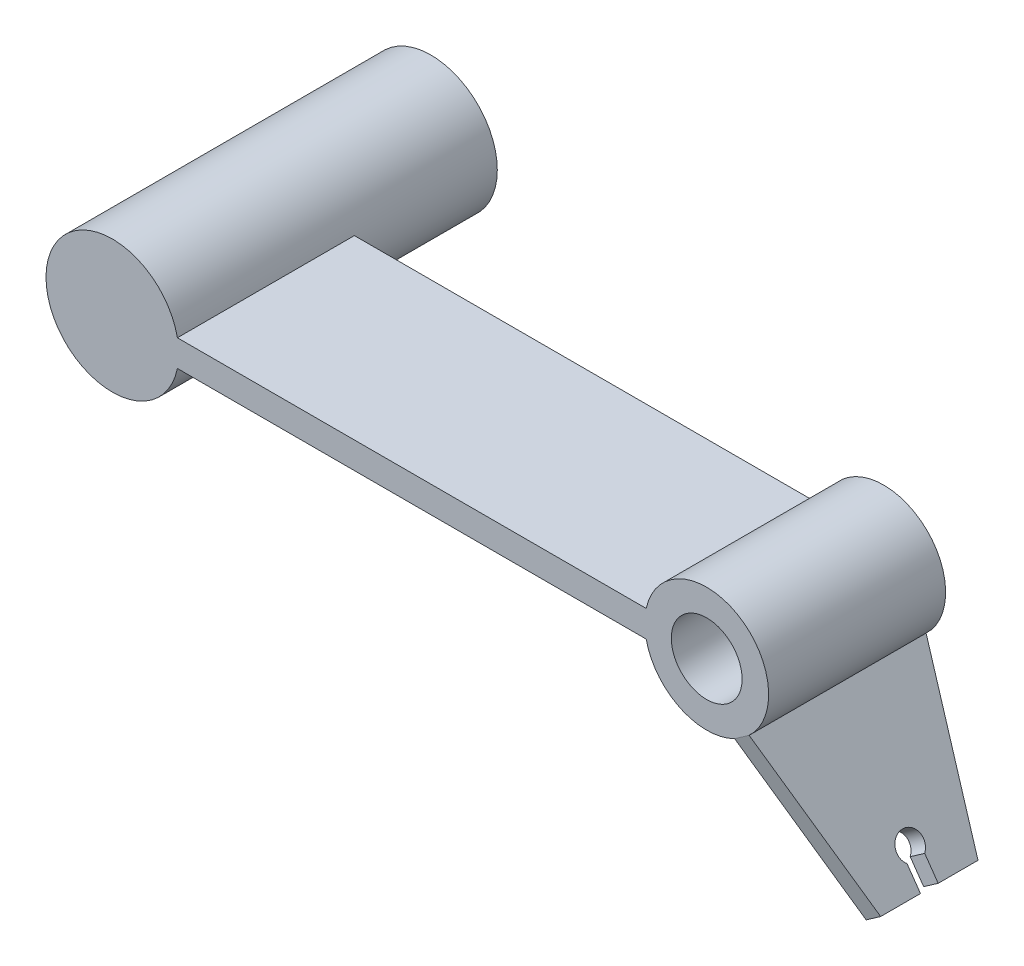
ISO-10303-21;
HEADER;
FILE_DESCRIPTION(('STEP AP214'),'2;1');
FILE_NAME('part.step','',(''),(''),'','','');
FILE_SCHEMA(('AUTOMOTIVE_DESIGN { 1 0 10303 214 1 1 1 1 }'));
ENDSEC;
DATA;
#1=APPLICATION_CONTEXT('core data for automotive mechanical design processes');
#2=APPLICATION_PROTOCOL_DEFINITION('international standard','automotive_design',2000,#1);
#3=PRODUCT_CONTEXT('',#1,'mechanical');
#4=PRODUCT('Part','Part','',(#3));
#5=PRODUCT_RELATED_PRODUCT_CATEGORY('part','',(#4));
#6=PRODUCT_DEFINITION_FORMATION('','',#4);
#7=PRODUCT_DEFINITION_CONTEXT('part definition',#1,'design');
#8=PRODUCT_DEFINITION('design','',#6,#7);
#9=PRODUCT_DEFINITION_SHAPE('','',#8);
#10=(LENGTH_UNIT() NAMED_UNIT(*) SI_UNIT(.MILLI.,.METRE.));
#11=(NAMED_UNIT(*) PLANE_ANGLE_UNIT() SI_UNIT($,.RADIAN.));
#12=(NAMED_UNIT(*) SI_UNIT($,.STERADIAN.) SOLID_ANGLE_UNIT());
#13=UNCERTAINTY_MEASURE_WITH_UNIT(LENGTH_MEASURE(1.E-05),#10,'distance_accuracy_value','');
#14=(GEOMETRIC_REPRESENTATION_CONTEXT(3) GLOBAL_UNCERTAINTY_ASSIGNED_CONTEXT((#13)) GLOBAL_UNIT_ASSIGNED_CONTEXT((#10,
#11,#12)) REPRESENTATION_CONTEXT('',''));
#15=CARTESIAN_POINT('',(0.,0.,0.));
#16=DIRECTION('',(0.,0.,1.));
#17=DIRECTION('',(1.,0.,0.));
#18=AXIS2_PLACEMENT_3D('',#15,#16,#17);
#19=CARTESIAN_POINT('',(0.,0.,20.));
#20=DIRECTION('',(0.,0.,-1.));
#21=DIRECTION('',(-1.,0.,0.));
#22=AXIS2_PLACEMENT_3D('',#19,#20,#21);
#23=CYLINDRICAL_SURFACE('',#22,7.);
#24=CARTESIAN_POINT('',(0.,0.,11.));
#25=DIRECTION('',(0.,0.,-1.));
#26=DIRECTION('',(-1.,0.,0.));
#27=AXIS2_PLACEMENT_3D('',#24,#25,#26);
#28=CIRCLE('',#27,7.);
#29=CARTESIAN_POINT('',(3.15470207484822,-6.24882827568083,11.));
#30=VERTEX_POINT('',#29);
#31=CARTESIAN_POINT('',(-6.83739716558867,-1.5,11.));
#32=VERTEX_POINT('',#31);
#33=EDGE_CURVE('E179',#30,#32,#28,.T.);
#34=ORIENTED_EDGE('',*,*,#33,.F.);
#35=DIRECTION('',(0.,0.,1.));
#36=VECTOR('',#35,1.);
#37=CARTESIAN_POINT('',(3.15470207484822,-6.24882827568083,-19.9629049680059));
#38=LINE('',#37,#36);
#39=CARTESIAN_POINT('',(3.15470207484822,-6.24882827568083,20.));
#40=VERTEX_POINT('',#39);
#41=EDGE_CURVE('E239',#30,#40,#38,.T.);
#42=ORIENTED_EDGE('',*,*,#41,.T.);
#43=CARTESIAN_POINT('',(0.,0.,20.));
#44=DIRECTION('',(0.,0.,1.));
#45=DIRECTION('',(1.,0.,0.));
#46=AXIS2_PLACEMENT_3D('',#43,#44,#45);
#47=CIRCLE('',#46,7.);
#48=CARTESIAN_POINT('',(-6.83739716558867,-1.5,20.));
#49=VERTEX_POINT('',#48);
#50=EDGE_CURVE('E260',#49,#40,#47,.T.);
#51=ORIENTED_EDGE('',*,*,#50,.F.);
#52=DIRECTION('',(0.,0.,-1.));
#53=VECTOR('',#52,1.);
#54=CARTESIAN_POINT('',(-6.83739716558867,-1.5,20.));
#55=LINE('',#54,#53);
#56=EDGE_CURVE('E279',#49,#32,#55,.T.);
#57=ORIENTED_EDGE('',*,*,#56,.T.);
#58=EDGE_LOOP('',(#34,#42,#51,#57));
#59=FACE_BOUND('',#58,.T.);
#60=ADVANCED_FACE('F38',(#59),#23,.T.);
#61=CARTESIAN_POINT('',(-67.1626028344113,-1.5,20.));
#62=DIRECTION('',(0.,1.,0.));
#63=DIRECTION('',(-1.,0.,0.));
#64=AXIS2_PLACEMENT_3D('',#61,#62,#63);
#65=PLANE('',#64);
#66=DIRECTION('',(-1.,0.,0.));
#67=VECTOR('',#66,1.);
#68=CARTESIAN_POINT('',(-6.83739716558867,-1.5,11.));
#69=LINE('',#68,#67);
#70=CARTESIAN_POINT('',(-25.2484276325332,-1.5,11.));
#71=VERTEX_POINT('',#70);
#72=EDGE_CURVE('E170',#32,#71,#69,.T.);
#73=ORIENTED_EDGE('',*,*,#72,.F.);
#74=ORIENTED_EDGE('',*,*,#56,.F.);
#75=DIRECTION('',(1.,0.,0.));
#76=VECTOR('',#75,1.);
#77=CARTESIAN_POINT('',(-67.1626028344113,-1.5,20.));
#78=LINE('',#77,#76);
#79=CARTESIAN_POINT('',(-59.8141336060618,-1.5,20.));
#80=VERTEX_POINT('',#79);
#81=EDGE_CURVE('E267',#80,#49,#78,.T.);
#82=ORIENTED_EDGE('',*,*,#81,.F.);
#83=DIRECTION('',(0.,0.,1.));
#84=VECTOR('',#83,1.);
#85=CARTESIAN_POINT('',(-59.8141336060618,-1.5,-16.));
#86=LINE('',#85,#84);
#87=CARTESIAN_POINT('',(-59.8141336060618,-1.5,0.));
#88=VERTEX_POINT('',#87);
#89=EDGE_CURVE('E11',#80,#88,#86,.F.);
#90=ORIENTED_EDGE('',*,*,#89,.T.);
#91=DIRECTION('',(1.,0.,0.));
#92=VECTOR('',#91,1.);
#93=CARTESIAN_POINT('',(-67.1626028344113,-1.5,0.));
#94=LINE('',#93,#92);
#95=CARTESIAN_POINT('',(-6.83739716558867,-1.5,0.));
#96=VERTEX_POINT('',#95);
#97=EDGE_CURVE('E276',#88,#96,#94,.T.);
#98=ORIENTED_EDGE('',*,*,#97,.T.);
#99=CARTESIAN_POINT('',(-6.83739716558867,-1.5,9.00000000000001));
#100=VERTEX_POINT('',#99);
#101=EDGE_CURVE('E269',#100,#96,#55,.T.);
#102=ORIENTED_EDGE('',*,*,#101,.F.);
#103=DIRECTION('',(-1.,0.,0.));
#104=VECTOR('',#103,1.);
#105=CARTESIAN_POINT('',(-6.83739716558867,-1.5,9.00000000000001));
#106=LINE('',#105,#104);
#107=CARTESIAN_POINT('',(-25.2484276325332,-1.5,9.00000000000001));
#108=VERTEX_POINT('',#107);
#109=EDGE_CURVE('E58',#100,#108,#106,.T.);
#110=ORIENTED_EDGE('',*,*,#109,.T.);
#111=DIRECTION('',(0.,0.,-1.));
#112=VECTOR('',#111,1.);
#113=CARTESIAN_POINT('',(-25.2484276325332,-1.5,11.));
#114=LINE('',#113,#112);
#115=EDGE_CURVE('E53',#71,#108,#114,.T.);
#116=ORIENTED_EDGE('',*,*,#115,.F.);
#117=EDGE_LOOP('',(#73,#74,#82,#90,#98,#102,#110,#116));
#118=FACE_BOUND('',#117,.T.);
#119=ADVANCED_FACE('F302',(#118),#65,.F.);
#120=CARTESIAN_POINT('',(13.5202588644871,-21.0523775435759,-19.9629049680059));
#121=DIRECTION('',(-0.819152044288993,-0.573576436351045,0.));
#122=DIRECTION('',(0.573576436351045,-0.819152044288993,0.));
#123=AXIS2_PLACEMENT_3D('',#120,#121,#122);
#124=PLANE('',#123);
#125=ORIENTED_EDGE('',*,*,#41,.F.);
#126=DIRECTION('',(-0.573576436351044,0.819152044288993,0.));
#127=VECTOR('',#126,1.);
#128=CARTESIAN_POINT('',(8.33748046966767,-13.6506029096284,11.));
#129=LINE('',#128,#127);
#130=CARTESIAN_POINT('',(8.33748046966767,-13.6506029096284,11.));
#131=VERTEX_POINT('',#130);
#132=EDGE_CURVE('E159',#131,#30,#129,.T.);
#133=ORIENTED_EDGE('',*,*,#132,.F.);
#134=DIRECTION('',(0.,0.,-1.));
#135=VECTOR('',#134,1.);
#136=CARTESIAN_POINT('',(8.33748046966767,-13.6506029096284,11.));
#137=LINE('',#136,#135);
#138=CARTESIAN_POINT('',(8.33748046966767,-13.6506029096284,9.00000000000001));
#139=VERTEX_POINT('',#138);
#140=EDGE_CURVE('E150',#131,#139,#137,.T.);
#141=ORIENTED_EDGE('',*,*,#140,.T.);
#142=DIRECTION('',(-0.573576436351044,0.819152044288993,0.));
#143=VECTOR('',#142,1.);
#144=CARTESIAN_POINT('',(8.33748046966767,-13.6506029096284,9.00000000000001));
#145=LINE('',#144,#143);
#146=CARTESIAN_POINT('',(3.15470207484822,-6.24882827568083,9.00000000000001));
#147=VERTEX_POINT('',#146);
#148=EDGE_CURVE('E156',#139,#147,#145,.T.);
#149=ORIENTED_EDGE('',*,*,#148,.T.);
#150=CARTESIAN_POINT('',(3.15470207484822,-6.24882827568083,0.));
#151=VERTEX_POINT('',#150);
#152=EDGE_CURVE('E237',#151,#147,#38,.T.);
#153=ORIENTED_EDGE('',*,*,#152,.F.);
#154=DIRECTION('',(0.556580706443766,-0.794879626498786,0.241628426704534));
#155=VECTOR('',#154,1.);
#156=CARTESIAN_POINT('',(13.5202588644871,-21.0523775435759,4.49999999999999));
#157=LINE('',#156,#155);
#158=CARTESIAN_POINT('',(13.5202588644871,-21.0523775435759,4.49999999999998));
#159=VERTEX_POINT('',#158);
#160=EDGE_CURVE('E184',#151,#159,#157,.T.);
#161=ORIENTED_EDGE('',*,*,#160,.T.);
#162=DIRECTION('',(0.,0.,1.));
#163=VECTOR('',#162,1.);
#164=CARTESIAN_POINT('',(13.5202588644871,-21.0523775435759,-19.9629049680059));
#165=LINE('',#164,#163);
#166=CARTESIAN_POINT('',(13.5202588644871,-21.0523775435759,9.));
#167=VERTEX_POINT('',#166);
#168=EDGE_CURVE('E234',#159,#167,#165,.T.);
#169=ORIENTED_EDGE('',*,*,#168,.T.);
#170=DIRECTION('',(0.573576436351045,-0.819152044288993,0.));
#171=VECTOR('',#170,1.);
#172=CARTESIAN_POINT('',(11.9981230656547,-18.8785423364825,9.));
#173=LINE('',#172,#171);
#174=CARTESIAN_POINT('',(11.9981230656547,-18.8785423364825,9.));
#175=VERTEX_POINT('',#174);
#176=EDGE_CURVE('E202',#175,#167,#173,.T.);
#177=ORIENTED_EDGE('',*,*,#176,.F.);
#178=CARTESIAN_POINT('',(11.3568451146682,-17.9627025090134,10.));
#179=DIRECTION('',(-0.819152044288993,-0.573576436351045,0.));
#180=DIRECTION('',(0.573576436351045,-0.819152044288993,0.));
#181=AXIS2_PLACEMENT_3D('',#178,#179,#180);
#182=CIRCLE('',#181,1.5);
#183=CARTESIAN_POINT('',(11.9981230656547,-18.8785423364825,11.));
#184=VERTEX_POINT('',#183);
#185=EDGE_CURVE('E208',#175,#184,#182,.F.);
#186=ORIENTED_EDGE('',*,*,#185,.T.);
#187=DIRECTION('',(0.573576436351045,-0.819152044288993,0.));
#188=VECTOR('',#187,1.);
#189=CARTESIAN_POINT('',(11.9981230656547,-18.8785423364825,11.));
#190=LINE('',#189,#188);
#191=CARTESIAN_POINT('',(13.5202588644871,-21.0523775435759,11.));
#192=VERTEX_POINT('',#191);
#193=EDGE_CURVE('E219',#184,#192,#190,.T.);
#194=ORIENTED_EDGE('',*,*,#193,.T.);
#195=CARTESIAN_POINT('',(13.5202588644871,-21.0523775435759,15.5));
#196=VERTEX_POINT('',#195);
#197=EDGE_CURVE('E236',#192,#196,#165,.T.);
#198=ORIENTED_EDGE('',*,*,#197,.T.);
#199=DIRECTION('',(-0.556580706443766,0.794879626498786,0.241628426704534));
#200=VECTOR('',#199,1.);
#201=CARTESIAN_POINT('',(3.15470207484821,-6.24882827568081,20.));
#202=LINE('',#201,#200);
#203=EDGE_CURVE('E195',#196,#40,#202,.T.);
#204=ORIENTED_EDGE('',*,*,#203,.T.);
#205=EDGE_LOOP('',(#125,#133,#141,#149,#153,#161,#169,#177,#186,#194,#198,#204));
#206=FACE_BOUND('',#205,.T.);
#207=ADVANCED_FACE('F153',(#206),#124,.T.);
#208=CARTESIAN_POINT('',(15.1585629530651,-19.9052246708738,-19.9629049680059));
#209=DIRECTION('',(0.573576436351044,-0.819152044288993,0.));
#210=DIRECTION('',(0.819152044288993,0.573576436351044,0.));
#211=AXIS2_PLACEMENT_3D('',#208,#209,#210);
#212=PLANE('',#211);
#213=DIRECTION('',(0.819152044288993,0.573576436351044,0.));
#214=VECTOR('',#213,1.);
#215=CARTESIAN_POINT('',(-45.6524703399068,-62.4855685889341,4.5));
#216=LINE('',#215,#214);
#217=CARTESIAN_POINT('',(15.1585629530651,-19.9052246708738,4.5));
#218=VERTEX_POINT('',#217);
#219=EDGE_CURVE('E189',#159,#218,#216,.T.);
#220=ORIENTED_EDGE('',*,*,#219,.T.);
#221=DIRECTION('',(0.,0.,1.));
#222=VECTOR('',#221,1.);
#223=CARTESIAN_POINT('',(15.1585629530651,-19.9052246708738,-19.9629049680059));
#224=LINE('',#223,#222);
#225=CARTESIAN_POINT('',(15.1585629530651,-19.9052246708738,9.));
#226=VERTEX_POINT('',#225);
#227=EDGE_CURVE('E230',#218,#226,#224,.T.);
#228=ORIENTED_EDGE('',*,*,#227,.T.);
#229=DIRECTION('',(0.819152044288993,0.573576436351044,0.));
#230=VECTOR('',#229,1.);
#231=CARTESIAN_POINT('',(8.55158741351989,-24.5314787484305,9.));
#232=LINE('',#231,#230);
#233=EDGE_CURVE('E223',#167,#226,#232,.T.);
#234=ORIENTED_EDGE('',*,*,#233,.F.);
#235=ORIENTED_EDGE('',*,*,#168,.F.);
#236=EDGE_LOOP('',(#220,#228,#234,#235));
#237=FACE_BOUND('',#236,.T.);
#238=ADVANCED_FACE('F328',(#237),#212,.T.);
#239=CARTESIAN_POINT('',(4.79300616342621,-5.10167540297874,20.));
#240=VERTEX_POINT('',#239);
#241=CARTESIAN_POINT('',(-6.83739716558867,1.5,20.));
#242=VERTEX_POINT('',#241);
#243=EDGE_CURVE('E264',#240,#242,#47,.T.);
#244=ORIENTED_EDGE('',*,*,#243,.F.);
#245=DIRECTION('',(0.,0.,1.));
#246=VECTOR('',#245,1.);
#247=CARTESIAN_POINT('',(4.79300616342621,-5.10167540297874,-19.9629049680059));
#248=LINE('',#247,#246);
#249=CARTESIAN_POINT('',(4.79300616342622,-5.10167540297874,0.));
#250=VERTEX_POINT('',#249);
#251=EDGE_CURVE('E212',#250,#240,#248,.T.);
#252=ORIENTED_EDGE('',*,*,#251,.F.);
#253=CARTESIAN_POINT('',(0.,0.,0.));
#254=DIRECTION('',(0.,0.,1.));
#255=DIRECTION('',(1.,0.,0.));
#256=AXIS2_PLACEMENT_3D('',#253,#254,#255);
#257=CIRCLE('',#256,7.);
#258=CARTESIAN_POINT('',(-6.83739716558867,1.5,0.));
#259=VERTEX_POINT('',#258);
#260=EDGE_CURVE('E257',#250,#259,#257,.T.);
#261=ORIENTED_EDGE('',*,*,#260,.T.);
#262=DIRECTION('',(0.,0.,-1.));
#263=VECTOR('',#262,1.);
#264=CARTESIAN_POINT('',(-6.83739716558867,1.5,20.));
#265=LINE('',#264,#263);
#266=EDGE_CURVE('E46',#242,#259,#265,.T.);
#267=ORIENTED_EDGE('',*,*,#266,.F.);
#268=EDGE_LOOP('',(#244,#252,#261,#267));
#269=FACE_BOUND('',#268,.T.);
#270=ADVANCED_FACE('F289',(#269),#23,.T.);
#271=CARTESIAN_POINT('',(0.,0.,20.));
#272=DIRECTION('',(0.,0.,1.));
#273=DIRECTION('',(1.,0.,0.));
#274=AXIS2_PLACEMENT_3D('',#271,#272,#273);
#275=PLANE('',#274);
#276=DIRECTION('',(0.819152044288993,0.573576436351044,0.));
#277=VECTOR('',#276,1.);
#278=CARTESIAN_POINT('',(-56.0180271295457,-47.6820193210391,20.));
#279=LINE('',#278,#277);
#280=EDGE_CURVE('E192',#40,#240,#279,.T.);
#281=ORIENTED_EDGE('',*,*,#280,.T.);
#282=ORIENTED_EDGE('',*,*,#243,.T.);
#283=DIRECTION('',(-1.,0.,0.));
#284=VECTOR('',#283,1.);
#285=CARTESIAN_POINT('',(-67.1626028344113,1.5,20.));
#286=LINE('',#285,#284);
#287=CARTESIAN_POINT('',(-59.8141336060618,1.5,20.));
#288=VERTEX_POINT('',#287);
#289=EDGE_CURVE('E263',#242,#288,#286,.T.);
#290=ORIENTED_EDGE('',*,*,#289,.T.);
#291=CARTESIAN_POINT('',(-67.1626028344113,0.,20.));
#292=DIRECTION('',(0.,0.,1.));
#293=DIRECTION('',(1.,0.,0.));
#294=AXIS2_PLACEMENT_3D('',#291,#292,#293);
#295=CIRCLE('',#294,7.5);
#296=EDGE_CURVE('E232',#288,#80,#295,.T.);
#297=ORIENTED_EDGE('',*,*,#296,.T.);
#298=ORIENTED_EDGE('',*,*,#81,.T.);
#299=ORIENTED_EDGE('',*,*,#50,.T.);
#300=EDGE_LOOP('',(#281,#282,#290,#297,#298,#299));
#301=FACE_BOUND('',#300,.T.);
#302=CARTESIAN_POINT('',(0.,0.,20.));
#303=DIRECTION('',(0.,0.,1.));
#304=DIRECTION('',(1.,0.,0.));
#305=AXIS2_PLACEMENT_3D('',#302,#303,#304);
#306=CIRCLE('',#305,4.);
#307=CARTESIAN_POINT('',(4.,0.,20.));
#308=VERTEX_POINT('',#307);
#309=EDGE_CURVE('E253',#308,#308,#306,.T.);
#310=ORIENTED_EDGE('',*,*,#309,.F.);
#311=EDGE_LOOP('',(#310));
#312=FACE_BOUND('',#311,.T.);
#313=ADVANCED_FACE('F306',(#301,#312),#275,.T.);
#314=CARTESIAN_POINT('',(0.,0.,0.));
#315=DIRECTION('',(0.,0.,1.));
#316=DIRECTION('',(1.,0.,0.));
#317=AXIS2_PLACEMENT_3D('',#314,#315,#316);
#318=PLANE('',#317);
#319=ORIENTED_EDGE('',*,*,#260,.F.);
#320=DIRECTION('',(0.819152044288993,0.573576436351044,0.));
#321=VECTOR('',#320,1.);
#322=CARTESIAN_POINT('',(-56.0180271295457,-47.6820193210391,0.));
#323=LINE('',#322,#321);
#324=EDGE_CURVE('E182',#151,#250,#323,.T.);
#325=ORIENTED_EDGE('',*,*,#324,.F.);
#326=EDGE_CURVE('E270',#96,#151,#257,.T.);
#327=ORIENTED_EDGE('',*,*,#326,.F.);
#328=ORIENTED_EDGE('',*,*,#97,.F.);
#329=CARTESIAN_POINT('',(-67.1626028344113,0.,0.));
#330=DIRECTION('',(0.,0.,1.));
#331=DIRECTION('',(1.,0.,0.));
#332=AXIS2_PLACEMENT_3D('',#329,#330,#331);
#333=CIRCLE('',#332,7.5);
#334=CARTESIAN_POINT('',(-59.8141336060618,1.5,0.));
#335=VERTEX_POINT('',#334);
#336=EDGE_CURVE('E245',#88,#335,#333,.T.);
#337=ORIENTED_EDGE('',*,*,#336,.T.);
#338=DIRECTION('',(-1.,0.,0.));
#339=VECTOR('',#338,1.);
#340=CARTESIAN_POINT('',(-67.1626028344113,1.5,0.));
#341=LINE('',#340,#339);
#342=EDGE_CURVE('E273',#259,#335,#341,.T.);
#343=ORIENTED_EDGE('',*,*,#342,.F.);
#344=EDGE_LOOP('',(#319,#325,#327,#328,#337,#343));
#345=FACE_BOUND('',#344,.T.);
#346=CARTESIAN_POINT('',(0.,0.,0.));
#347=DIRECTION('',(0.,0.,1.));
#348=DIRECTION('',(1.,0.,0.));
#349=AXIS2_PLACEMENT_3D('',#346,#347,#348);
#350=CIRCLE('',#349,4.);
#351=CARTESIAN_POINT('',(4.,0.,0.));
#352=VERTEX_POINT('',#351);
#353=EDGE_CURVE('E252',#352,#352,#350,.T.);
#354=ORIENTED_EDGE('',*,*,#353,.T.);
#355=EDGE_LOOP('',(#354));
#356=FACE_BOUND('',#355,.T.);
#357=ADVANCED_FACE('F294',(#345,#356),#318,.F.);
#358=ORIENTED_EDGE('',*,*,#152,.T.);
#359=CARTESIAN_POINT('',(0.,0.,9.00000000000001));
#360=DIRECTION('',(0.,0.,-1.));
#361=DIRECTION('',(-1.,0.,0.));
#362=AXIS2_PLACEMENT_3D('',#359,#360,#361);
#363=CIRCLE('',#362,7.);
#364=EDGE_CURVE('E169',#147,#100,#363,.T.);
#365=ORIENTED_EDGE('',*,*,#364,.T.);
#366=ORIENTED_EDGE('',*,*,#101,.T.);
#367=ORIENTED_EDGE('',*,*,#326,.T.);
#368=EDGE_LOOP('',(#358,#365,#366,#367));
#369=FACE_BOUND('',#368,.T.);
#370=ADVANCED_FACE('F40',(#369),#23,.T.);
#371=CARTESIAN_POINT('',(-67.1626028344113,1.5,20.));
#372=DIRECTION('',(0.,-1.,0.));
#373=DIRECTION('',(1.,0.,0.));
#374=AXIS2_PLACEMENT_3D('',#371,#372,#373);
#375=PLANE('',#374);
#376=ORIENTED_EDGE('',*,*,#342,.T.);
#377=DIRECTION('',(0.,0.,1.));
#378=VECTOR('',#377,1.);
#379=CARTESIAN_POINT('',(-59.8141336060618,1.5,-16.));
#380=LINE('',#379,#378);
#381=EDGE_CURVE('E249',#335,#288,#380,.T.);
#382=ORIENTED_EDGE('',*,*,#381,.T.);
#383=ORIENTED_EDGE('',*,*,#289,.F.);
#384=ORIENTED_EDGE('',*,*,#266,.T.);
#385=EDGE_LOOP('',(#376,#382,#383,#384));
#386=FACE_BOUND('',#385,.T.);
#387=ADVANCED_FACE('F285',(#386),#375,.F.);
#388=CARTESIAN_POINT('',(0.,0.,20.));
#389=DIRECTION('',(0.,0.,-1.));
#390=DIRECTION('',(-1.,0.,0.));
#391=AXIS2_PLACEMENT_3D('',#388,#389,#390);
#392=CYLINDRICAL_SURFACE('',#391,4.);
#393=ORIENTED_EDGE('',*,*,#309,.T.);
#394=EDGE_LOOP('',(#393));
#395=FACE_BOUND('',#394,.T.);
#396=ORIENTED_EDGE('',*,*,#353,.F.);
#397=EDGE_LOOP('',(#396));
#398=FACE_BOUND('',#397,.T.);
#399=ADVANCED_FACE('F362',(#395,#398),#392,.F.);
#400=CARTESIAN_POINT('',(-67.1626028344113,0.,-16.));
#401=DIRECTION('',(0.,0.,1.));
#402=DIRECTION('',(1.,0.,0.));
#403=AXIS2_PLACEMENT_3D('',#400,#401,#402);
#404=CYLINDRICAL_SURFACE('',#403,7.5);
#405=CARTESIAN_POINT('',(-67.1626028344113,0.,-16.));
#406=DIRECTION('',(0.,0.,1.));
#407=DIRECTION('',(1.,0.,0.));
#408=AXIS2_PLACEMENT_3D('',#405,#406,#407);
#409=CIRCLE('',#408,7.5);
#410=CARTESIAN_POINT('',(-59.6626028344113,0.,-16.));
#411=VERTEX_POINT('',#410);
#412=EDGE_CURVE('E242',#411,#411,#409,.T.);
#413=ORIENTED_EDGE('',*,*,#412,.T.);
#414=EDGE_LOOP('',(#413));
#415=FACE_BOUND('',#414,.T.);
#416=ORIENTED_EDGE('',*,*,#381,.F.);
#417=ORIENTED_EDGE('',*,*,#336,.F.);
#418=ORIENTED_EDGE('',*,*,#89,.F.);
#419=ORIENTED_EDGE('',*,*,#296,.F.);
#420=EDGE_LOOP('',(#416,#417,#418,#419));
#421=FACE_BOUND('',#420,.T.);
#422=ADVANCED_FACE('F300',(#415,#421),#404,.T.);
#423=CARTESIAN_POINT('',(-67.1626028344113,0.,-16.));
#424=DIRECTION('',(0.,0.,1.));
#425=DIRECTION('',(1.,0.,0.));
#426=AXIS2_PLACEMENT_3D('',#423,#424,#425);
#427=PLANE('',#426);
#428=ORIENTED_EDGE('',*,*,#412,.F.);
#429=EDGE_LOOP('',(#428));
#430=FACE_BOUND('',#429,.T.);
#431=ADVANCED_FACE('F468',(#430),#427,.F.);
#432=CARTESIAN_POINT('',(15.1585629530651,-19.9052246708738,-19.9629049680059));
#433=DIRECTION('',(0.819152044288993,0.573576436351044,0.));
#434=DIRECTION('',(-0.573576436351044,0.819152044288993,0.));
#435=AXIS2_PLACEMENT_3D('',#432,#433,#434);
#436=PLANE('',#435);
#437=DIRECTION('',(0.556580706443766,-0.794879626498786,0.241628426704534));
#438=VECTOR('',#437,1.);
#439=CARTESIAN_POINT('',(15.1585629530651,-19.9052246708738,4.5));
#440=LINE('',#439,#438);
#441=EDGE_CURVE('E187',#250,#218,#440,.T.);
#442=ORIENTED_EDGE('',*,*,#441,.F.);
#443=ORIENTED_EDGE('',*,*,#251,.T.);
#444=DIRECTION('',(-0.556580706443766,0.794879626498786,0.241628426704534));
#445=VECTOR('',#444,1.);
#446=CARTESIAN_POINT('',(4.79300616342622,-5.10167540297874,20.));
#447=LINE('',#446,#445);
#448=CARTESIAN_POINT('',(15.1585629530651,-19.9052246708738,15.5));
#449=VERTEX_POINT('',#448);
#450=EDGE_CURVE('E198',#449,#240,#447,.T.);
#451=ORIENTED_EDGE('',*,*,#450,.F.);
#452=CARTESIAN_POINT('',(15.1585629530651,-19.9052246708738,11.));
#453=VERTEX_POINT('',#452);
#454=EDGE_CURVE('E233',#453,#449,#224,.T.);
#455=ORIENTED_EDGE('',*,*,#454,.F.);
#456=DIRECTION('',(0.573576436351044,-0.819152044288993,0.));
#457=VECTOR('',#456,1.);
#458=CARTESIAN_POINT('',(13.6364271542327,-17.7313894637804,11.));
#459=LINE('',#458,#457);
#460=CARTESIAN_POINT('',(13.6364271542327,-17.7313894637804,11.));
#461=VERTEX_POINT('',#460);
#462=EDGE_CURVE('E206',#461,#453,#459,.T.);
#463=ORIENTED_EDGE('',*,*,#462,.F.);
#464=CARTESIAN_POINT('',(12.9951492032462,-16.8155496363113,10.));
#465=DIRECTION('',(0.819152044288993,0.573576436351044,0.));
#466=DIRECTION('',(-0.573576436351044,0.819152044288993,0.));
#467=AXIS2_PLACEMENT_3D('',#464,#465,#466);
#468=CIRCLE('',#467,1.5);
#469=CARTESIAN_POINT('',(13.6364271542327,-17.7313894637804,9.));
#470=VERTEX_POINT('',#469);
#471=EDGE_CURVE('E203',#470,#461,#468,.T.);
#472=ORIENTED_EDGE('',*,*,#471,.F.);
#473=DIRECTION('',(0.573576436351045,-0.819152044288993,0.));
#474=VECTOR('',#473,1.);
#475=CARTESIAN_POINT('',(13.6364271542327,-17.7313894637804,9.));
#476=LINE('',#475,#474);
#477=EDGE_CURVE('E209',#470,#226,#476,.T.);
#478=ORIENTED_EDGE('',*,*,#477,.T.);
#479=ORIENTED_EDGE('',*,*,#227,.F.);
#480=EDGE_LOOP('',(#442,#443,#451,#455,#463,#472,#478,#479));
#481=FACE_BOUND('',#480,.T.);
#482=ADVANCED_FACE('F321',(#481),#436,.T.);
#483=DIRECTION('',(0.819152044288993,0.573576436351044,0.));
#484=VECTOR('',#483,1.);
#485=CARTESIAN_POINT('',(-45.6524703399068,-62.4855685889341,15.5));
#486=LINE('',#485,#484);
#487=EDGE_CURVE('E200',#196,#449,#486,.T.);
#488=ORIENTED_EDGE('',*,*,#487,.F.);
#489=ORIENTED_EDGE('',*,*,#197,.F.);
#490=DIRECTION('',(0.819152044288993,0.573576436351044,0.));
#491=VECTOR('',#490,1.);
#492=CARTESIAN_POINT('',(8.55158741351989,-24.5314787484305,11.));
#493=LINE('',#492,#491);
#494=EDGE_CURVE('E222',#192,#453,#493,.T.);
#495=ORIENTED_EDGE('',*,*,#494,.T.);
#496=ORIENTED_EDGE('',*,*,#454,.T.);
#497=EDGE_LOOP('',(#488,#489,#495,#496));
#498=FACE_BOUND('',#497,.T.);
#499=ADVANCED_FACE('F316',(#498),#212,.T.);
#500=CARTESIAN_POINT('',(6.38817366370093,-21.441803713868,10.));
#501=DIRECTION('',(0.819152044288993,0.573576436351044,0.));
#502=DIRECTION('',(-0.573576436351044,0.819152044288993,0.));
#503=AXIS2_PLACEMENT_3D('',#500,#501,#502);
#504=CYLINDRICAL_SURFACE('',#503,1.5);
#505=DIRECTION('',(0.819152044288993,0.573576436351044,0.));
#506=VECTOR('',#505,1.);
#507=CARTESIAN_POINT('',(7.02945161468744,-22.3576435413371,9.));
#508=LINE('',#507,#506);
#509=EDGE_CURVE('E213',#175,#470,#508,.T.);
#510=ORIENTED_EDGE('',*,*,#509,.T.);
#511=ORIENTED_EDGE('',*,*,#471,.T.);
#512=DIRECTION('',(0.819152044288993,0.573576436351044,0.));
#513=VECTOR('',#512,1.);
#514=CARTESIAN_POINT('',(7.02945161468744,-22.3576435413371,11.));
#515=LINE('',#514,#513);
#516=EDGE_CURVE('E216',#184,#461,#515,.T.);
#517=ORIENTED_EDGE('',*,*,#516,.F.);
#518=ORIENTED_EDGE('',*,*,#185,.F.);
#519=EDGE_LOOP('',(#510,#511,#517,#518));
#520=FACE_BOUND('',#519,.T.);
#521=ADVANCED_FACE('F338',(#520),#504,.F.);
#522=CARTESIAN_POINT('',(7.02945161468744,-22.3576435413371,11.));
#523=DIRECTION('',(0.,0.,1.));
#524=DIRECTION('',(1.,0.,0.));
#525=AXIS2_PLACEMENT_3D('',#522,#523,#524);
#526=PLANE('',#525);
#527=ORIENTED_EDGE('',*,*,#516,.T.);
#528=ORIENTED_EDGE('',*,*,#462,.T.);
#529=ORIENTED_EDGE('',*,*,#494,.F.);
#530=ORIENTED_EDGE('',*,*,#193,.F.);
#531=EDGE_LOOP('',(#527,#528,#529,#530));
#532=FACE_BOUND('',#531,.T.);
#533=ADVANCED_FACE('F340',(#532),#526,.F.);
#534=CARTESIAN_POINT('',(7.02945161468744,-22.3576435413371,9.));
#535=DIRECTION('',(0.,0.,1.));
#536=DIRECTION('',(0.,-1.,0.));
#537=AXIS2_PLACEMENT_3D('',#534,#535,#536);
#538=PLANE('',#537);
#539=ORIENTED_EDGE('',*,*,#176,.T.);
#540=ORIENTED_EDGE('',*,*,#233,.T.);
#541=ORIENTED_EDGE('',*,*,#477,.F.);
#542=ORIENTED_EDGE('',*,*,#509,.F.);
#543=EDGE_LOOP('',(#539,#540,#541,#542));
#544=FACE_BOUND('',#543,.T.);
#545=ADVANCED_FACE('F332',(#544),#538,.T.);
#546=CARTESIAN_POINT('',(-56.0180271295457,-47.6820193210391,20.));
#547=DIRECTION('',(-0.138592371910296,0.197930419693352,-0.970368849153914));
#548=DIRECTION('',(0.,0.979824635770892,0.199859158250099));
#549=AXIS2_PLACEMENT_3D('',#546,#547,#548);
#550=PLANE('',#549);
#551=ORIENTED_EDGE('',*,*,#487,.T.);
#552=ORIENTED_EDGE('',*,*,#450,.T.);
#553=ORIENTED_EDGE('',*,*,#280,.F.);
#554=ORIENTED_EDGE('',*,*,#203,.F.);
#555=EDGE_LOOP('',(#551,#552,#553,#554));
#556=FACE_BOUND('',#555,.T.);
#557=ADVANCED_FACE('F310',(#556),#550,.F.);
#558=CARTESIAN_POINT('',(-45.6524703399068,-62.4855685889341,4.5));
#559=DIRECTION('',(-0.138592371910296,0.197930419693352,0.970368849153914));
#560=DIRECTION('',(0.,-0.979824635770892,0.199859158250099));
#561=AXIS2_PLACEMENT_3D('',#558,#559,#560);
#562=PLANE('',#561);
#563=ORIENTED_EDGE('',*,*,#324,.T.);
#564=ORIENTED_EDGE('',*,*,#441,.T.);
#565=ORIENTED_EDGE('',*,*,#219,.F.);
#566=ORIENTED_EDGE('',*,*,#160,.F.);
#567=EDGE_LOOP('',(#563,#564,#565,#566));
#568=FACE_BOUND('',#567,.T.);
#569=ADVANCED_FACE('F325',(#568),#562,.F.);
#570=CARTESIAN_POINT('',(0.,0.,11.));
#571=DIRECTION('',(0.,0.,-1.));
#572=DIRECTION('',(-1.,0.,0.));
#573=AXIS2_PLACEMENT_3D('',#570,#571,#572);
#574=PLANE('',#573);
#575=ORIENTED_EDGE('',*,*,#132,.T.);
#576=ORIENTED_EDGE('',*,*,#33,.T.);
#577=ORIENTED_EDGE('',*,*,#72,.T.);
#578=DIRECTION('',(0.940353758988587,-0.340198189230975,0.));
#579=VECTOR('',#578,1.);
#580=CARTESIAN_POINT('',(-25.2484276325332,-1.5,11.));
#581=LINE('',#580,#579);
#582=EDGE_CURVE('E173',#71,#131,#581,.T.);
#583=ORIENTED_EDGE('',*,*,#582,.T.);
#584=EDGE_LOOP('',(#575,#576,#577,#583));
#585=FACE_BOUND('',#584,.T.);
#586=ADVANCED_FACE('F367',(#585),#574,.F.);
#587=CARTESIAN_POINT('',(0.,0.,9.00000000000001));
#588=DIRECTION('',(0.,0.,-1.));
#589=DIRECTION('',(-1.,0.,0.));
#590=AXIS2_PLACEMENT_3D('',#587,#588,#589);
#591=PLANE('',#590);
#592=ORIENTED_EDGE('',*,*,#364,.F.);
#593=ORIENTED_EDGE('',*,*,#148,.F.);
#594=DIRECTION('',(0.940353758988587,-0.340198189230975,0.));
#595=VECTOR('',#594,1.);
#596=CARTESIAN_POINT('',(-25.2484276325332,-1.5,9.00000000000001));
#597=LINE('',#596,#595);
#598=EDGE_CURVE('E163',#108,#139,#597,.T.);
#599=ORIENTED_EDGE('',*,*,#598,.F.);
#600=ORIENTED_EDGE('',*,*,#109,.F.);
#601=EDGE_LOOP('',(#592,#593,#599,#600));
#602=FACE_BOUND('',#601,.T.);
#603=ADVANCED_FACE('F168',(#602),#591,.T.);
#604=CARTESIAN_POINT('',(-25.2484276325332,-1.5,11.));
#605=DIRECTION('',(0.340198189230975,0.940353758988587,0.));
#606=DIRECTION('',(-0.940353758988587,0.340198189230975,0.));
#607=AXIS2_PLACEMENT_3D('',#604,#605,#606);
#608=PLANE('',#607);
#609=ORIENTED_EDGE('',*,*,#598,.T.);
#610=ORIENTED_EDGE('',*,*,#140,.F.);
#611=ORIENTED_EDGE('',*,*,#582,.F.);
#612=ORIENTED_EDGE('',*,*,#115,.T.);
#613=EDGE_LOOP('',(#609,#610,#611,#612));
#614=FACE_BOUND('',#613,.T.);
#615=ADVANCED_FACE('F164',(#614),#608,.F.);
#616=CLOSED_SHELL('',(#60,#119,#207,#238,#270,#313,#357,#370,#387,#399,#422,#431,#482,#499,#521,
#533,#545,#557,#569,#586,#603,#615));
#617=MANIFOLD_SOLID_BREP('B2',#616);
#618=ADVANCED_BREP_SHAPE_REPRESENTATION('',(#18,#617),#14);
#619=SHAPE_DEFINITION_REPRESENTATION(#9,#618);
ENDSEC;
END-ISO-10303-21;
